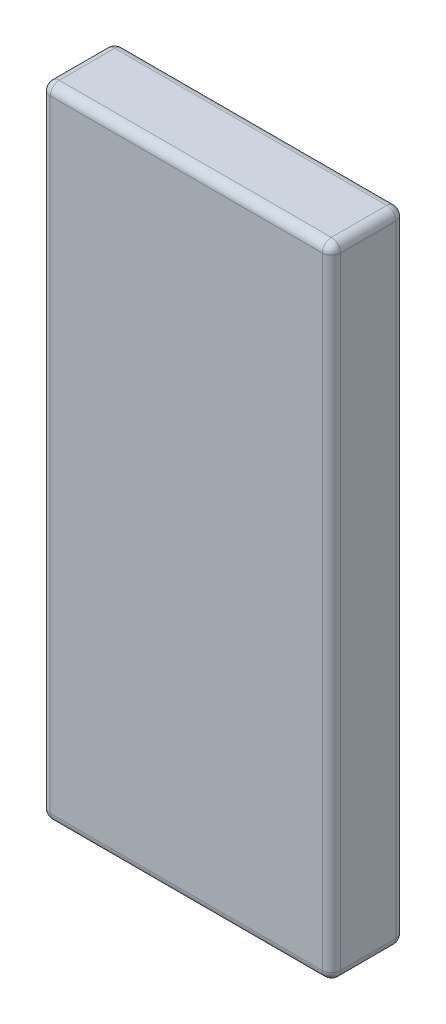
ISO-10303-21;
HEADER;
FILE_DESCRIPTION(('STEP AP214'),'2;1');
FILE_NAME('part.step','',(''),(''),'','','');
FILE_SCHEMA(('AUTOMOTIVE_DESIGN { 1 0 10303 214 1 1 1 1 }'));
ENDSEC;
DATA;
#1=APPLICATION_CONTEXT('core data for automotive mechanical design processes');
#2=APPLICATION_PROTOCOL_DEFINITION('international standard','automotive_design',2000,#1);
#3=PRODUCT_CONTEXT('',#1,'mechanical');
#4=PRODUCT('Part','Part','',(#3));
#5=PRODUCT_RELATED_PRODUCT_CATEGORY('part','',(#4));
#6=PRODUCT_DEFINITION_FORMATION('','',#4);
#7=PRODUCT_DEFINITION_CONTEXT('part definition',#1,'design');
#8=PRODUCT_DEFINITION('design','',#6,#7);
#9=PRODUCT_DEFINITION_SHAPE('','',#8);
#10=(LENGTH_UNIT() NAMED_UNIT(*) SI_UNIT(.MILLI.,.METRE.));
#11=(NAMED_UNIT(*) PLANE_ANGLE_UNIT() SI_UNIT($,.RADIAN.));
#12=(NAMED_UNIT(*) SI_UNIT($,.STERADIAN.) SOLID_ANGLE_UNIT());
#13=UNCERTAINTY_MEASURE_WITH_UNIT(LENGTH_MEASURE(1.E-05),#10,'distance_accuracy_value','');
#14=(GEOMETRIC_REPRESENTATION_CONTEXT(3) GLOBAL_UNCERTAINTY_ASSIGNED_CONTEXT((#13)) GLOBAL_UNIT_ASSIGNED_CONTEXT((#10,
#11,#12)) REPRESENTATION_CONTEXT('',''));
#15=CARTESIAN_POINT('',(0.,0.,0.));
#16=DIRECTION('',(0.,0.,1.));
#17=DIRECTION('',(1.,0.,0.));
#18=AXIS2_PLACEMENT_3D('',#15,#16,#17);
#19=CARTESIAN_POINT('',(-16.3760524459598,55.7720574898184,8.1));
#20=DIRECTION('',(1.,0.,0.));
#21=DIRECTION('',(0.,0.,-1.));
#22=AXIS2_PLACEMENT_3D('',#19,#20,#21);
#23=PLANE('',#22);
#24=DIRECTION('',(0.,0.,-1.));
#25=VECTOR('',#24,1.);
#26=CARTESIAN_POINT('',(-16.3760524459598,54.7720574898184,8.1));
#27=LINE('',#26,#25);
#28=CARTESIAN_POINT('',(-16.3760524459598,54.7720574898184,7.1));
#29=VERTEX_POINT('',#28);
#30=CARTESIAN_POINT('',(-16.3760524459598,54.7720574898184,1.));
#31=VERTEX_POINT('',#30);
#32=EDGE_CURVE('E118',#29,#31,#27,.T.);
#33=ORIENTED_EDGE('',*,*,#32,.T.);
#34=DIRECTION('',(0.,-1.,0.));
#35=VECTOR('',#34,1.);
#36=CARTESIAN_POINT('',(-16.3760524459598,55.7720574898184,1.));
#37=LINE('',#36,#35);
#38=CARTESIAN_POINT('',(-16.3760524459598,-13.7279425101816,1.));
#39=VERTEX_POINT('',#38);
#40=EDGE_CURVE('E114',#31,#39,#37,.T.);
#41=ORIENTED_EDGE('',*,*,#40,.T.);
#42=DIRECTION('',(0.,0.,-1.));
#43=VECTOR('',#42,1.);
#44=CARTESIAN_POINT('',(-16.3760524459598,-13.7279425101816,8.1));
#45=LINE('',#44,#43);
#46=CARTESIAN_POINT('',(-16.3760524459598,-13.7279425101816,7.1));
#47=VERTEX_POINT('',#46);
#48=EDGE_CURVE('E109',#39,#47,#45,.F.);
#49=ORIENTED_EDGE('',*,*,#48,.T.);
#50=DIRECTION('',(0.,-1.,0.));
#51=VECTOR('',#50,1.);
#52=CARTESIAN_POINT('',(-16.3760524459598,55.7720574898184,7.1));
#53=LINE('',#52,#51);
#54=EDGE_CURVE('E111',#47,#29,#53,.F.);
#55=ORIENTED_EDGE('',*,*,#54,.T.);
#56=EDGE_LOOP('',(#33,#41,#49,#55));
#57=FACE_BOUND('',#56,.T.);
#58=ADVANCED_FACE('F17',(#57),#23,.F.);
#59=CARTESIAN_POINT('',(-16.3760524459598,-14.7279425101816,8.1));
#60=DIRECTION('',(0.,1.,0.));
#61=DIRECTION('',(0.,0.,1.));
#62=AXIS2_PLACEMENT_3D('',#59,#60,#61);
#63=PLANE('',#62);
#64=DIRECTION('',(1.,0.,0.));
#65=VECTOR('',#64,1.);
#66=CARTESIAN_POINT('',(-16.3760524459598,-14.7279425101816,1.));
#67=LINE('',#66,#65);
#68=CARTESIAN_POINT('',(-15.3760524459597,-14.7279425101816,1.));
#69=VERTEX_POINT('',#68);
#70=CARTESIAN_POINT('',(14.6239475540403,-14.7279425101816,1.));
#71=VERTEX_POINT('',#70);
#72=EDGE_CURVE('E258',#69,#71,#67,.T.);
#73=ORIENTED_EDGE('',*,*,#72,.T.);
#74=DIRECTION('',(0.,0.,-1.));
#75=VECTOR('',#74,1.);
#76=CARTESIAN_POINT('',(14.6239475540403,-14.7279425101816,8.1));
#77=LINE('',#76,#75);
#78=CARTESIAN_POINT('',(14.6239475540403,-14.7279425101816,7.1));
#79=VERTEX_POINT('',#78);
#80=EDGE_CURVE('E261',#71,#79,#77,.F.);
#81=ORIENTED_EDGE('',*,*,#80,.T.);
#82=DIRECTION('',(1.,0.,0.));
#83=VECTOR('',#82,1.);
#84=CARTESIAN_POINT('',(-16.3760524459598,-14.7279425101816,7.1));
#85=LINE('',#84,#83);
#86=CARTESIAN_POINT('',(-15.3760524459597,-14.7279425101816,7.1));
#87=VERTEX_POINT('',#86);
#88=EDGE_CURVE('E252',#79,#87,#85,.F.);
#89=ORIENTED_EDGE('',*,*,#88,.T.);
#90=DIRECTION('',(0.,0.,-1.));
#91=VECTOR('',#90,1.);
#92=CARTESIAN_POINT('',(-15.3760524459597,-14.7279425101816,8.1));
#93=LINE('',#92,#91);
#94=EDGE_CURVE('E140',#87,#69,#93,.T.);
#95=ORIENTED_EDGE('',*,*,#94,.T.);
#96=EDGE_LOOP('',(#73,#81,#89,#95));
#97=FACE_BOUND('',#96,.T.);
#98=ADVANCED_FACE('F308',(#97),#63,.F.);
#99=CARTESIAN_POINT('',(15.6239475540402,55.7720574898184,8.1));
#100=DIRECTION('',(-1.,0.,0.));
#101=DIRECTION('',(0.,0.,1.));
#102=AXIS2_PLACEMENT_3D('',#99,#100,#101);
#103=PLANE('',#102);
#104=DIRECTION('',(0.,1.,0.));
#105=VECTOR('',#104,1.);
#106=CARTESIAN_POINT('',(15.6239475540402,55.7720574898184,1.));
#107=LINE('',#106,#105);
#108=CARTESIAN_POINT('',(15.6239475540402,-13.7279425101816,1.));
#109=VERTEX_POINT('',#108);
#110=CARTESIAN_POINT('',(15.6239475540402,54.7720574898184,1.));
#111=VERTEX_POINT('',#110);
#112=EDGE_CURVE('E267',#109,#111,#107,.T.);
#113=ORIENTED_EDGE('',*,*,#112,.T.);
#114=DIRECTION('',(0.,0.,-1.));
#115=VECTOR('',#114,1.);
#116=CARTESIAN_POINT('',(15.6239475540402,54.7720574898184,8.1));
#117=LINE('',#116,#115);
#118=CARTESIAN_POINT('',(15.6239475540402,54.7720574898184,7.1));
#119=VERTEX_POINT('',#118);
#120=EDGE_CURVE('E195',#111,#119,#117,.F.);
#121=ORIENTED_EDGE('',*,*,#120,.T.);
#122=DIRECTION('',(0.,1.,0.));
#123=VECTOR('',#122,1.);
#124=CARTESIAN_POINT('',(15.6239475540402,-14.7279425101816,7.1));
#125=LINE('',#124,#123);
#126=CARTESIAN_POINT('',(15.6239475540402,-13.7279425101816,7.1));
#127=VERTEX_POINT('',#126);
#128=EDGE_CURVE('E265',#119,#127,#125,.F.);
#129=ORIENTED_EDGE('',*,*,#128,.T.);
#130=DIRECTION('',(0.,0.,-1.));
#131=VECTOR('',#130,1.);
#132=CARTESIAN_POINT('',(15.6239475540402,-13.7279425101816,8.1));
#133=LINE('',#132,#131);
#134=EDGE_CURVE('E263',#127,#109,#133,.T.);
#135=ORIENTED_EDGE('',*,*,#134,.T.);
#136=EDGE_LOOP('',(#113,#121,#129,#135));
#137=FACE_BOUND('',#136,.T.);
#138=ADVANCED_FACE('F269',(#137),#103,.F.);
#139=CARTESIAN_POINT('',(-16.3760524459598,55.7720574898184,8.1));
#140=DIRECTION('',(0.,-1.,0.));
#141=DIRECTION('',(0.,0.,-1.));
#142=AXIS2_PLACEMENT_3D('',#139,#140,#141);
#143=PLANE('',#142);
#144=DIRECTION('',(0.,0.,-1.));
#145=VECTOR('',#144,1.);
#146=CARTESIAN_POINT('',(14.6239475540403,55.7720574898184,8.1));
#147=LINE('',#146,#145);
#148=CARTESIAN_POINT('',(14.6239475540403,55.7720574898184,7.1));
#149=VERTEX_POINT('',#148);
#150=CARTESIAN_POINT('',(14.6239475540403,55.7720574898184,1.));
#151=VERTEX_POINT('',#150);
#152=EDGE_CURVE('E197',#149,#151,#147,.T.);
#153=ORIENTED_EDGE('',*,*,#152,.T.);
#154=DIRECTION('',(-1.,0.,0.));
#155=VECTOR('',#154,1.);
#156=CARTESIAN_POINT('',(-16.3760524459598,55.7720574898184,1.));
#157=LINE('',#156,#155);
#158=CARTESIAN_POINT('',(-15.3760524459597,55.7720574898184,1.));
#159=VERTEX_POINT('',#158);
#160=EDGE_CURVE('E204',#151,#159,#157,.T.);
#161=ORIENTED_EDGE('',*,*,#160,.T.);
#162=DIRECTION('',(0.,0.,-1.));
#163=VECTOR('',#162,1.);
#164=CARTESIAN_POINT('',(-15.3760524459597,55.7720574898184,8.1));
#165=LINE('',#164,#163);
#166=CARTESIAN_POINT('',(-15.3760524459597,55.7720574898184,7.1));
#167=VERTEX_POINT('',#166);
#168=EDGE_CURVE('E201',#159,#167,#165,.F.);
#169=ORIENTED_EDGE('',*,*,#168,.T.);
#170=DIRECTION('',(-1.,0.,0.));
#171=VECTOR('',#170,1.);
#172=CARTESIAN_POINT('',(15.6239475540402,55.7720574898184,7.1));
#173=LINE('',#172,#171);
#174=EDGE_CURVE('E202',#167,#149,#173,.F.);
#175=ORIENTED_EDGE('',*,*,#174,.T.);
#176=EDGE_LOOP('',(#153,#161,#169,#175));
#177=FACE_BOUND('',#176,.T.);
#178=ADVANCED_FACE('F284',(#177),#143,.F.);
#179=CARTESIAN_POINT('',(0.,0.,8.1));
#180=DIRECTION('',(0.,0.,1.));
#181=DIRECTION('',(1.,0.,0.));
#182=AXIS2_PLACEMENT_3D('',#179,#180,#181);
#183=PLANE('',#182);
#184=DIRECTION('',(0.,-1.,0.));
#185=VECTOR('',#184,1.);
#186=CARTESIAN_POINT('',(-15.3760524459597,-14.7279425101816,8.1));
#187=LINE('',#186,#185);
#188=CARTESIAN_POINT('',(-15.3760524459597,54.7720574898184,8.1));
#189=VERTEX_POINT('',#188);
#190=CARTESIAN_POINT('',(-15.3760524459597,-13.7279425101816,8.1));
#191=VERTEX_POINT('',#190);
#192=EDGE_CURVE('E210',#189,#191,#187,.T.);
#193=ORIENTED_EDGE('',*,*,#192,.T.);
#194=DIRECTION('',(1.,0.,0.));
#195=VECTOR('',#194,1.);
#196=CARTESIAN_POINT('',(15.6239475540402,-13.7279425101816,8.1));
#197=LINE('',#196,#195);
#198=CARTESIAN_POINT('',(14.6239475540403,-13.7279425101816,8.1));
#199=VERTEX_POINT('',#198);
#200=EDGE_CURVE('E11',#191,#199,#197,.T.);
#201=ORIENTED_EDGE('',*,*,#200,.T.);
#202=DIRECTION('',(0.,1.,0.));
#203=VECTOR('',#202,1.);
#204=CARTESIAN_POINT('',(14.6239475540403,55.7720574898184,8.1));
#205=LINE('',#204,#203);
#206=CARTESIAN_POINT('',(14.6239475540403,54.7720574898184,8.1));
#207=VERTEX_POINT('',#206);
#208=EDGE_CURVE('E26',#199,#207,#205,.T.);
#209=ORIENTED_EDGE('',*,*,#208,.T.);
#210=DIRECTION('',(-1.,0.,0.));
#211=VECTOR('',#210,1.);
#212=CARTESIAN_POINT('',(-16.3760524459598,54.7720574898184,8.1));
#213=LINE('',#212,#211);
#214=EDGE_CURVE('E212',#207,#189,#213,.T.);
#215=ORIENTED_EDGE('',*,*,#214,.T.);
#216=EDGE_LOOP('',(#193,#201,#209,#215));
#217=FACE_BOUND('',#216,.T.);
#218=ADVANCED_FACE('F333',(#217),#183,.T.);
#219=CARTESIAN_POINT('',(0.,0.,0.));
#220=DIRECTION('',(0.,0.,1.));
#221=DIRECTION('',(1.,0.,0.));
#222=AXIS2_PLACEMENT_3D('',#219,#220,#221);
#223=PLANE('',#222);
#224=DIRECTION('',(1.,0.,0.));
#225=VECTOR('',#224,1.);
#226=CARTESIAN_POINT('',(0.,-13.7279425101816,0.));
#227=LINE('',#226,#225);
#228=CARTESIAN_POINT('',(14.6239475540403,-13.7279425101816,0.));
#229=VERTEX_POINT('',#228);
#230=CARTESIAN_POINT('',(-15.3760524459597,-13.7279425101816,0.));
#231=VERTEX_POINT('',#230);
#232=EDGE_CURVE('E247',#229,#231,#227,.F.);
#233=ORIENTED_EDGE('',*,*,#232,.T.);
#234=DIRECTION('',(0.,-1.,0.));
#235=VECTOR('',#234,1.);
#236=CARTESIAN_POINT('',(-15.3760524459597,0.,0.));
#237=LINE('',#236,#235);
#238=CARTESIAN_POINT('',(-15.3760524459597,54.7720574898184,0.));
#239=VERTEX_POINT('',#238);
#240=EDGE_CURVE('E244',#231,#239,#237,.F.);
#241=ORIENTED_EDGE('',*,*,#240,.T.);
#242=DIRECTION('',(-1.,0.,0.));
#243=VECTOR('',#242,1.);
#244=CARTESIAN_POINT('',(0.,54.7720574898184,0.));
#245=LINE('',#244,#243);
#246=CARTESIAN_POINT('',(14.6239475540403,54.7720574898184,0.));
#247=VERTEX_POINT('',#246);
#248=EDGE_CURVE('E236',#239,#247,#245,.F.);
#249=ORIENTED_EDGE('',*,*,#248,.T.);
#250=DIRECTION('',(0.,1.,0.));
#251=VECTOR('',#250,1.);
#252=CARTESIAN_POINT('',(14.6239475540403,0.,0.));
#253=LINE('',#252,#251);
#254=EDGE_CURVE('E241',#247,#229,#253,.F.);
#255=ORIENTED_EDGE('',*,*,#254,.T.);
#256=EDGE_LOOP('',(#233,#241,#249,#255));
#257=FACE_BOUND('',#256,.T.);
#258=ADVANCED_FACE('F245',(#257),#223,.F.);
#259=CARTESIAN_POINT('',(14.6239475540403,0.,7.1));
#260=DIRECTION('',(0.,-1.,0.));
#261=DIRECTION('',(0.,0.,-1.));
#262=AXIS2_PLACEMENT_3D('',#259,#260,#261);
#263=CYLINDRICAL_SURFACE('',#262,1.);
#264=CARTESIAN_POINT('',(14.6239475540403,54.7720574898184,7.1));
#265=DIRECTION('',(0.,1.,0.));
#266=DIRECTION('',(0.,0.,1.));
#267=AXIS2_PLACEMENT_3D('',#264,#265,#266);
#268=CIRCLE('',#267,1.);
#269=EDGE_CURVE('E21',#207,#119,#268,.T.);
#270=ORIENTED_EDGE('',*,*,#269,.F.);
#271=ORIENTED_EDGE('',*,*,#208,.F.);
#272=CARTESIAN_POINT('',(14.6239475540403,-13.7279425101816,7.1));
#273=DIRECTION('',(0.,-1.,0.));
#274=DIRECTION('',(0.,0.,-1.));
#275=AXIS2_PLACEMENT_3D('',#272,#273,#274);
#276=CIRCLE('',#275,1.);
#277=EDGE_CURVE('E178',#127,#199,#276,.T.);
#278=ORIENTED_EDGE('',*,*,#277,.F.);
#279=ORIENTED_EDGE('',*,*,#128,.F.);
#280=EDGE_LOOP('',(#270,#271,#278,#279));
#281=FACE_BOUND('',#280,.T.);
#282=ADVANCED_FACE('F19',(#281),#263,.T.);
#283=CARTESIAN_POINT('',(14.6239475540403,54.7720574898184,7.1));
#284=DIRECTION('',(0.,0.,1.));
#285=DIRECTION('',(1.,0.,0.));
#286=AXIS2_PLACEMENT_3D('',#283,#284,#285);
#287=SPHERICAL_SURFACE('',#286,1.);
#288=CARTESIAN_POINT('',(14.6239475540403,54.7720574898184,7.1));
#289=DIRECTION('',(1.,0.,0.));
#290=DIRECTION('',(0.,0.,-1.));
#291=AXIS2_PLACEMENT_3D('',#288,#289,#290);
#292=CIRCLE('',#291,1.);
#293=EDGE_CURVE('E173',#207,#149,#292,.F.);
#294=ORIENTED_EDGE('',*,*,#293,.F.);
#295=ORIENTED_EDGE('',*,*,#269,.T.);
#296=CARTESIAN_POINT('',(14.6239475540403,54.7720574898184,7.1));
#297=DIRECTION('',(0.,0.,1.));
#298=DIRECTION('',(1.,0.,0.));
#299=AXIS2_PLACEMENT_3D('',#296,#297,#298);
#300=CIRCLE('',#299,1.);
#301=EDGE_CURVE('E176',#149,#119,#300,.F.);
#302=ORIENTED_EDGE('',*,*,#301,.F.);
#303=EDGE_LOOP('',(#294,#295,#302));
#304=FACE_BOUND('',#303,.T.);
#305=ADVANCED_FACE('F186',(#304),#287,.T.);
#306=CARTESIAN_POINT('',(14.6239475540403,-13.7279425101816,7.1));
#307=DIRECTION('',(0.,0.,1.));
#308=DIRECTION('',(1.,0.,0.));
#309=AXIS2_PLACEMENT_3D('',#306,#307,#308);
#310=SPHERICAL_SURFACE('',#309,1.);
#311=CARTESIAN_POINT('',(14.6239475540403,-13.7279425101816,7.1));
#312=DIRECTION('',(0.,0.,1.));
#313=DIRECTION('',(1.,0.,0.));
#314=AXIS2_PLACEMENT_3D('',#311,#312,#313);
#315=CIRCLE('',#314,1.);
#316=EDGE_CURVE('E169',#127,#79,#315,.F.);
#317=ORIENTED_EDGE('',*,*,#316,.F.);
#318=ORIENTED_EDGE('',*,*,#277,.T.);
#319=CARTESIAN_POINT('',(14.6239475540403,-13.7279425101816,7.1));
#320=DIRECTION('',(1.,0.,0.));
#321=DIRECTION('',(0.,0.,-1.));
#322=AXIS2_PLACEMENT_3D('',#319,#320,#321);
#323=CIRCLE('',#322,1.);
#324=EDGE_CURVE('E34',#79,#199,#323,.F.);
#325=ORIENTED_EDGE('',*,*,#324,.F.);
#326=EDGE_LOOP('',(#317,#318,#325));
#327=FACE_BOUND('',#326,.T.);
#328=ADVANCED_FACE('F272',(#327),#310,.T.);
#329=CARTESIAN_POINT('',(14.6239475540403,54.7720574898184,8.1));
#330=DIRECTION('',(0.,0.,-1.));
#331=DIRECTION('',(-1.,0.,0.));
#332=AXIS2_PLACEMENT_3D('',#329,#330,#331);
#333=CYLINDRICAL_SURFACE('',#332,1.);
#334=ORIENTED_EDGE('',*,*,#301,.T.);
#335=ORIENTED_EDGE('',*,*,#120,.F.);
#336=CARTESIAN_POINT('',(14.6239475540403,54.7720574898184,1.));
#337=DIRECTION('',(0.,0.,-1.));
#338=DIRECTION('',(-1.,0.,0.));
#339=AXIS2_PLACEMENT_3D('',#336,#337,#338);
#340=CIRCLE('',#339,1.);
#341=EDGE_CURVE('E164',#151,#111,#340,.T.);
#342=ORIENTED_EDGE('',*,*,#341,.F.);
#343=ORIENTED_EDGE('',*,*,#152,.F.);
#344=EDGE_LOOP('',(#334,#335,#342,#343));
#345=FACE_BOUND('',#344,.T.);
#346=ADVANCED_FACE('F193',(#345),#333,.T.);
#347=CARTESIAN_POINT('',(0.,54.7720574898184,7.1));
#348=DIRECTION('',(1.,0.,0.));
#349=DIRECTION('',(0.,0.,-1.));
#350=AXIS2_PLACEMENT_3D('',#347,#348,#349);
#351=CYLINDRICAL_SURFACE('',#350,1.);
#352=ORIENTED_EDGE('',*,*,#293,.T.);
#353=ORIENTED_EDGE('',*,*,#174,.F.);
#354=CARTESIAN_POINT('',(-15.3760524459597,54.7720574898184,7.1));
#355=DIRECTION('',(-1.,0.,0.));
#356=DIRECTION('',(0.,0.,1.));
#357=AXIS2_PLACEMENT_3D('',#354,#355,#356);
#358=CIRCLE('',#357,1.);
#359=EDGE_CURVE('E161',#189,#167,#358,.T.);
#360=ORIENTED_EDGE('',*,*,#359,.F.);
#361=ORIENTED_EDGE('',*,*,#214,.F.);
#362=EDGE_LOOP('',(#352,#353,#360,#361));
#363=FACE_BOUND('',#362,.T.);
#364=ADVANCED_FACE('F289',(#363),#351,.T.);
#365=CARTESIAN_POINT('',(-15.3760524459597,0.,7.1));
#366=DIRECTION('',(0.,1.,0.));
#367=DIRECTION('',(0.,0.,1.));
#368=AXIS2_PLACEMENT_3D('',#365,#366,#367);
#369=CYLINDRICAL_SURFACE('',#368,1.);
#370=CARTESIAN_POINT('',(-15.3760524459597,-13.7279425101816,7.1));
#371=DIRECTION('',(0.,-1.,0.));
#372=DIRECTION('',(0.,0.,-1.));
#373=AXIS2_PLACEMENT_3D('',#370,#371,#372);
#374=CIRCLE('',#373,1.);
#375=EDGE_CURVE('E125',#191,#47,#374,.T.);
#376=ORIENTED_EDGE('',*,*,#375,.F.);
#377=ORIENTED_EDGE('',*,*,#192,.F.);
#378=CARTESIAN_POINT('',(-15.3760524459597,54.7720574898184,7.1));
#379=DIRECTION('',(0.,1.,0.));
#380=DIRECTION('',(0.,0.,1.));
#381=AXIS2_PLACEMENT_3D('',#378,#379,#380);
#382=CIRCLE('',#381,1.);
#383=EDGE_CURVE('E128',#29,#189,#382,.T.);
#384=ORIENTED_EDGE('',*,*,#383,.F.);
#385=ORIENTED_EDGE('',*,*,#54,.F.);
#386=EDGE_LOOP('',(#376,#377,#384,#385));
#387=FACE_BOUND('',#386,.T.);
#388=ADVANCED_FACE('F123',(#387),#369,.T.);
#389=CARTESIAN_POINT('',(0.,-13.7279425101816,7.1));
#390=DIRECTION('',(-1.,0.,0.));
#391=DIRECTION('',(0.,0.,1.));
#392=AXIS2_PLACEMENT_3D('',#389,#390,#391);
#393=CYLINDRICAL_SURFACE('',#392,1.);
#394=ORIENTED_EDGE('',*,*,#324,.T.);
#395=ORIENTED_EDGE('',*,*,#200,.F.);
#396=CARTESIAN_POINT('',(-15.3760524459597,-13.7279425101816,7.1));
#397=DIRECTION('',(-1.,0.,0.));
#398=DIRECTION('',(0.,0.,1.));
#399=AXIS2_PLACEMENT_3D('',#396,#397,#398);
#400=CIRCLE('',#399,1.);
#401=EDGE_CURVE('E137',#87,#191,#400,.T.);
#402=ORIENTED_EDGE('',*,*,#401,.F.);
#403=ORIENTED_EDGE('',*,*,#88,.F.);
#404=EDGE_LOOP('',(#394,#395,#402,#403));
#405=FACE_BOUND('',#404,.T.);
#406=ADVANCED_FACE('F332',(#405),#393,.T.);
#407=CARTESIAN_POINT('',(14.6239475540403,-13.7279425101816,8.1));
#408=DIRECTION('',(0.,0.,-1.));
#409=DIRECTION('',(-1.,0.,0.));
#410=AXIS2_PLACEMENT_3D('',#407,#408,#409);
#411=CYLINDRICAL_SURFACE('',#410,1.);
#412=ORIENTED_EDGE('',*,*,#316,.T.);
#413=ORIENTED_EDGE('',*,*,#80,.F.);
#414=CARTESIAN_POINT('',(14.6239475540403,-13.7279425101816,1.));
#415=DIRECTION('',(0.,0.,-1.));
#416=DIRECTION('',(-1.,0.,0.));
#417=AXIS2_PLACEMENT_3D('',#414,#415,#416);
#418=CIRCLE('',#417,1.);
#419=EDGE_CURVE('E156',#109,#71,#418,.T.);
#420=ORIENTED_EDGE('',*,*,#419,.F.);
#421=ORIENTED_EDGE('',*,*,#134,.F.);
#422=EDGE_LOOP('',(#412,#413,#420,#421));
#423=FACE_BOUND('',#422,.T.);
#424=ADVANCED_FACE('F276',(#423),#411,.T.);
#425=CARTESIAN_POINT('',(14.6239475540403,55.7720574898184,1.));
#426=DIRECTION('',(0.,1.,0.));
#427=DIRECTION('',(0.,0.,1.));
#428=AXIS2_PLACEMENT_3D('',#425,#426,#427);
#429=CYLINDRICAL_SURFACE('',#428,1.);
#430=CARTESIAN_POINT('',(14.6239475540403,54.7720574898184,1.));
#431=DIRECTION('',(0.,1.,0.));
#432=DIRECTION('',(0.,0.,1.));
#433=AXIS2_PLACEMENT_3D('',#430,#431,#432);
#434=CIRCLE('',#433,1.);
#435=EDGE_CURVE('E166',#111,#247,#434,.T.);
#436=ORIENTED_EDGE('',*,*,#435,.F.);
#437=ORIENTED_EDGE('',*,*,#112,.F.);
#438=CARTESIAN_POINT('',(14.6239475540403,-13.7279425101816,1.));
#439=DIRECTION('',(0.,-1.,0.));
#440=DIRECTION('',(0.,0.,-1.));
#441=AXIS2_PLACEMENT_3D('',#438,#439,#440);
#442=CIRCLE('',#441,1.);
#443=EDGE_CURVE('E153',#229,#109,#442,.T.);
#444=ORIENTED_EDGE('',*,*,#443,.F.);
#445=ORIENTED_EDGE('',*,*,#254,.F.);
#446=EDGE_LOOP('',(#436,#437,#444,#445));
#447=FACE_BOUND('',#446,.T.);
#448=ADVANCED_FACE('F280',(#447),#429,.T.);
#449=CARTESIAN_POINT('',(14.6239475540403,54.7720574898184,1.));
#450=DIRECTION('',(0.,0.,1.));
#451=DIRECTION('',(1.,0.,0.));
#452=AXIS2_PLACEMENT_3D('',#449,#450,#451);
#453=SPHERICAL_SURFACE('',#452,1.);
#454=ORIENTED_EDGE('',*,*,#341,.T.);
#455=ORIENTED_EDGE('',*,*,#435,.T.);
#456=CARTESIAN_POINT('',(14.6239475540403,54.7720574898184,1.));
#457=DIRECTION('',(1.,0.,0.));
#458=DIRECTION('',(0.,0.,-1.));
#459=AXIS2_PLACEMENT_3D('',#456,#457,#458);
#460=CIRCLE('',#459,1.);
#461=EDGE_CURVE('E145',#151,#247,#460,.F.);
#462=ORIENTED_EDGE('',*,*,#461,.F.);
#463=EDGE_LOOP('',(#454,#455,#462));
#464=FACE_BOUND('',#463,.T.);
#465=ADVANCED_FACE('F283',(#464),#453,.T.);
#466=CARTESIAN_POINT('',(-15.3760524459597,54.7720574898184,7.1));
#467=DIRECTION('',(0.,0.,1.));
#468=DIRECTION('',(1.,0.,0.));
#469=AXIS2_PLACEMENT_3D('',#466,#467,#468);
#470=SPHERICAL_SURFACE('',#469,1.);
#471=ORIENTED_EDGE('',*,*,#383,.T.);
#472=ORIENTED_EDGE('',*,*,#359,.T.);
#473=CARTESIAN_POINT('',(-15.3760524459597,54.7720574898184,7.1));
#474=DIRECTION('',(0.,0.,1.));
#475=DIRECTION('',(1.,0.,0.));
#476=AXIS2_PLACEMENT_3D('',#473,#474,#475);
#477=CIRCLE('',#476,1.);
#478=EDGE_CURVE('E141',#29,#167,#477,.F.);
#479=ORIENTED_EDGE('',*,*,#478,.F.);
#480=EDGE_LOOP('',(#471,#472,#479));
#481=FACE_BOUND('',#480,.T.);
#482=ADVANCED_FACE('F291',(#481),#470,.T.);
#483=CARTESIAN_POINT('',(-15.3760524459597,-13.7279425101816,7.1));
#484=DIRECTION('',(0.,0.,1.));
#485=DIRECTION('',(1.,0.,0.));
#486=AXIS2_PLACEMENT_3D('',#483,#484,#485);
#487=SPHERICAL_SURFACE('',#486,1.);
#488=ORIENTED_EDGE('',*,*,#401,.T.);
#489=ORIENTED_EDGE('',*,*,#375,.T.);
#490=CARTESIAN_POINT('',(-15.3760524459597,-13.7279425101816,7.1));
#491=DIRECTION('',(0.,0.,1.));
#492=DIRECTION('',(1.,0.,0.));
#493=AXIS2_PLACEMENT_3D('',#490,#491,#492);
#494=CIRCLE('',#493,1.);
#495=EDGE_CURVE('E134',#87,#47,#494,.F.);
#496=ORIENTED_EDGE('',*,*,#495,.F.);
#497=EDGE_LOOP('',(#488,#489,#496));
#498=FACE_BOUND('',#497,.T.);
#499=ADVANCED_FACE('F133',(#498),#487,.T.);
#500=CARTESIAN_POINT('',(14.6239475540403,-13.7279425101816,1.));
#501=DIRECTION('',(0.,0.,1.));
#502=DIRECTION('',(1.,0.,0.));
#503=AXIS2_PLACEMENT_3D('',#500,#501,#502);
#504=SPHERICAL_SURFACE('',#503,1.);
#505=ORIENTED_EDGE('',*,*,#443,.T.);
#506=ORIENTED_EDGE('',*,*,#419,.T.);
#507=CARTESIAN_POINT('',(14.6239475540403,-13.7279425101816,1.));
#508=DIRECTION('',(1.,0.,0.));
#509=DIRECTION('',(0.,0.,-1.));
#510=AXIS2_PLACEMENT_3D('',#507,#508,#509);
#511=CIRCLE('',#510,1.);
#512=EDGE_CURVE('E142',#229,#71,#511,.F.);
#513=ORIENTED_EDGE('',*,*,#512,.F.);
#514=EDGE_LOOP('',(#505,#506,#513));
#515=FACE_BOUND('',#514,.T.);
#516=ADVANCED_FACE('F305',(#515),#504,.T.);
#517=CARTESIAN_POINT('',(-16.3760524459598,54.7720574898184,1.));
#518=DIRECTION('',(-1.,0.,0.));
#519=DIRECTION('',(0.,0.,1.));
#520=AXIS2_PLACEMENT_3D('',#517,#518,#519);
#521=CYLINDRICAL_SURFACE('',#520,1.);
#522=ORIENTED_EDGE('',*,*,#461,.T.);
#523=ORIENTED_EDGE('',*,*,#248,.F.);
#524=CARTESIAN_POINT('',(-15.3760524459597,54.7720574898184,1.));
#525=DIRECTION('',(-1.,0.,0.));
#526=DIRECTION('',(0.,0.,1.));
#527=AXIS2_PLACEMENT_3D('',#524,#525,#526);
#528=CIRCLE('',#527,1.);
#529=EDGE_CURVE('E147',#159,#239,#528,.T.);
#530=ORIENTED_EDGE('',*,*,#529,.F.);
#531=ORIENTED_EDGE('',*,*,#160,.F.);
#532=EDGE_LOOP('',(#522,#523,#530,#531));
#533=FACE_BOUND('',#532,.T.);
#534=ADVANCED_FACE('F238',(#533),#521,.T.);
#535=CARTESIAN_POINT('',(-15.3760524459597,54.7720574898184,8.1));
#536=DIRECTION('',(0.,0.,-1.));
#537=DIRECTION('',(-1.,0.,0.));
#538=AXIS2_PLACEMENT_3D('',#535,#536,#537);
#539=CYLINDRICAL_SURFACE('',#538,1.);
#540=ORIENTED_EDGE('',*,*,#478,.T.);
#541=ORIENTED_EDGE('',*,*,#168,.F.);
#542=CARTESIAN_POINT('',(-15.3760524459597,54.7720574898184,1.));
#543=DIRECTION('',(0.,0.,-1.));
#544=DIRECTION('',(-1.,0.,0.));
#545=AXIS2_PLACEMENT_3D('',#542,#543,#544);
#546=CIRCLE('',#545,1.);
#547=EDGE_CURVE('E225',#31,#159,#546,.T.);
#548=ORIENTED_EDGE('',*,*,#547,.F.);
#549=ORIENTED_EDGE('',*,*,#32,.F.);
#550=EDGE_LOOP('',(#540,#541,#548,#549));
#551=FACE_BOUND('',#550,.T.);
#552=ADVANCED_FACE('F293',(#551),#539,.T.);
#553=CARTESIAN_POINT('',(-15.3760524459597,-13.7279425101816,8.1));
#554=DIRECTION('',(0.,0.,-1.));
#555=DIRECTION('',(-1.,0.,0.));
#556=AXIS2_PLACEMENT_3D('',#553,#554,#555);
#557=CYLINDRICAL_SURFACE('',#556,1.);
#558=ORIENTED_EDGE('',*,*,#495,.T.);
#559=ORIENTED_EDGE('',*,*,#48,.F.);
#560=CARTESIAN_POINT('',(-15.3760524459597,-13.7279425101816,1.));
#561=DIRECTION('',(0.,0.,-1.));
#562=DIRECTION('',(-1.,0.,0.));
#563=AXIS2_PLACEMENT_3D('',#560,#561,#562);
#564=CIRCLE('',#563,1.);
#565=EDGE_CURVE('E222',#69,#39,#564,.T.);
#566=ORIENTED_EDGE('',*,*,#565,.F.);
#567=ORIENTED_EDGE('',*,*,#94,.F.);
#568=EDGE_LOOP('',(#558,#559,#566,#567));
#569=FACE_BOUND('',#568,.T.);
#570=ADVANCED_FACE('F139',(#569),#557,.T.);
#571=CARTESIAN_POINT('',(-16.3760524459598,-13.7279425101816,1.));
#572=DIRECTION('',(1.,0.,0.));
#573=DIRECTION('',(0.,0.,-1.));
#574=AXIS2_PLACEMENT_3D('',#571,#572,#573);
#575=CYLINDRICAL_SURFACE('',#574,1.);
#576=ORIENTED_EDGE('',*,*,#512,.T.);
#577=ORIENTED_EDGE('',*,*,#72,.F.);
#578=CARTESIAN_POINT('',(-15.3760524459597,-13.7279425101816,1.));
#579=DIRECTION('',(-1.,0.,0.));
#580=DIRECTION('',(0.,0.,1.));
#581=AXIS2_PLACEMENT_3D('',#578,#579,#580);
#582=CIRCLE('',#581,1.);
#583=EDGE_CURVE('E219',#231,#69,#582,.T.);
#584=ORIENTED_EDGE('',*,*,#583,.F.);
#585=ORIENTED_EDGE('',*,*,#232,.F.);
#586=EDGE_LOOP('',(#576,#577,#584,#585));
#587=FACE_BOUND('',#586,.T.);
#588=ADVANCED_FACE('F303',(#587),#575,.T.);
#589=CARTESIAN_POINT('',(-15.3760524459597,54.7720574898184,1.));
#590=DIRECTION('',(0.,0.,1.));
#591=DIRECTION('',(1.,0.,0.));
#592=AXIS2_PLACEMENT_3D('',#589,#590,#591);
#593=SPHERICAL_SURFACE('',#592,1.);
#594=ORIENTED_EDGE('',*,*,#547,.T.);
#595=ORIENTED_EDGE('',*,*,#529,.T.);
#596=CARTESIAN_POINT('',(-15.3760524459597,54.7720574898184,1.));
#597=DIRECTION('',(0.,1.,0.));
#598=DIRECTION('',(0.,0.,1.));
#599=AXIS2_PLACEMENT_3D('',#596,#597,#598);
#600=CIRCLE('',#599,1.);
#601=EDGE_CURVE('E217',#31,#239,#600,.F.);
#602=ORIENTED_EDGE('',*,*,#601,.F.);
#603=EDGE_LOOP('',(#594,#595,#602));
#604=FACE_BOUND('',#603,.T.);
#605=ADVANCED_FACE('F231',(#604),#593,.T.);
#606=CARTESIAN_POINT('',(-15.3760524459597,-13.7279425101816,1.));
#607=DIRECTION('',(0.,0.,1.));
#608=DIRECTION('',(1.,0.,0.));
#609=AXIS2_PLACEMENT_3D('',#606,#607,#608);
#610=SPHERICAL_SURFACE('',#609,1.);
#611=ORIENTED_EDGE('',*,*,#583,.T.);
#612=ORIENTED_EDGE('',*,*,#565,.T.);
#613=CARTESIAN_POINT('',(-15.3760524459597,-13.7279425101816,1.));
#614=DIRECTION('',(0.,-1.,0.));
#615=DIRECTION('',(0.,0.,-1.));
#616=AXIS2_PLACEMENT_3D('',#613,#614,#615);
#617=CIRCLE('',#616,1.);
#618=EDGE_CURVE('E215',#231,#39,#617,.F.);
#619=ORIENTED_EDGE('',*,*,#618,.F.);
#620=EDGE_LOOP('',(#611,#612,#619));
#621=FACE_BOUND('',#620,.T.);
#622=ADVANCED_FACE('F320',(#621),#610,.T.);
#623=CARTESIAN_POINT('',(-15.3760524459597,55.7720574898184,1.));
#624=DIRECTION('',(0.,-1.,0.));
#625=DIRECTION('',(0.,0.,-1.));
#626=AXIS2_PLACEMENT_3D('',#623,#624,#625);
#627=CYLINDRICAL_SURFACE('',#626,1.);
#628=ORIENTED_EDGE('',*,*,#601,.T.);
#629=ORIENTED_EDGE('',*,*,#240,.F.);
#630=ORIENTED_EDGE('',*,*,#618,.T.);
#631=ORIENTED_EDGE('',*,*,#40,.F.);
#632=EDGE_LOOP('',(#628,#629,#630,#631));
#633=FACE_BOUND('',#632,.T.);
#634=ADVANCED_FACE('F317',(#633),#627,.T.);
#635=CLOSED_SHELL('',(#58,#98,#138,#178,#218,#258,#282,#305,#328,#346,#364,#388,#406,#424,#448,
#465,#482,#499,#516,#534,#552,#570,#588,#605,#622,#634));
#636=MANIFOLD_SOLID_BREP('B1',#635);
#637=ADVANCED_BREP_SHAPE_REPRESENTATION('',(#18,#636),#14);
#638=SHAPE_DEFINITION_REPRESENTATION(#9,#637);
ENDSEC;
END-ISO-10303-21;
